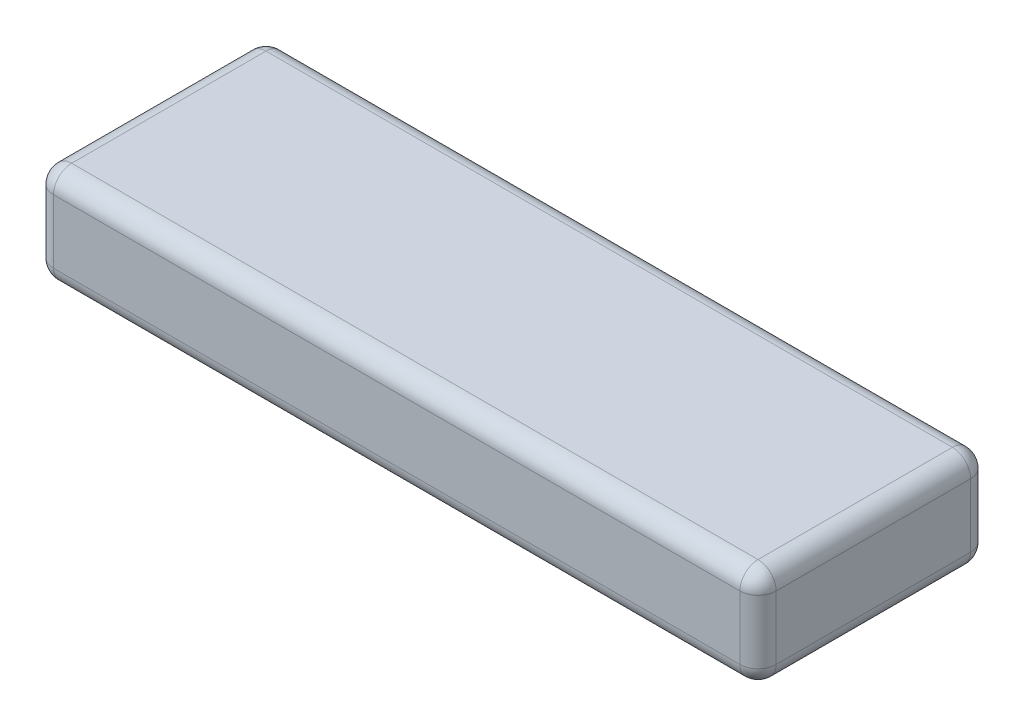
ISO-10303-21;
HEADER;
FILE_DESCRIPTION(('STEP AP214'),'2;1');
FILE_NAME('part.step','',(''),(''),'','','');
FILE_SCHEMA(('AUTOMOTIVE_DESIGN { 1 0 10303 214 1 1 1 1 }'));
ENDSEC;
DATA;
#1=APPLICATION_CONTEXT('core data for automotive mechanical design processes');
#2=APPLICATION_PROTOCOL_DEFINITION('international standard','automotive_design',2000,#1);
#3=PRODUCT_CONTEXT('',#1,'mechanical');
#4=PRODUCT('Part','Part','',(#3));
#5=PRODUCT_RELATED_PRODUCT_CATEGORY('part','',(#4));
#6=PRODUCT_DEFINITION_FORMATION('','',#4);
#7=PRODUCT_DEFINITION_CONTEXT('part definition',#1,'design');
#8=PRODUCT_DEFINITION('design','',#6,#7);
#9=PRODUCT_DEFINITION_SHAPE('','',#8);
#10=(LENGTH_UNIT() NAMED_UNIT(*) SI_UNIT(.MILLI.,.METRE.));
#11=(NAMED_UNIT(*) PLANE_ANGLE_UNIT() SI_UNIT($,.RADIAN.));
#12=(NAMED_UNIT(*) SI_UNIT($,.STERADIAN.) SOLID_ANGLE_UNIT());
#13=UNCERTAINTY_MEASURE_WITH_UNIT(LENGTH_MEASURE(1.E-05),#10,'distance_accuracy_value','');
#14=(GEOMETRIC_REPRESENTATION_CONTEXT(3) GLOBAL_UNCERTAINTY_ASSIGNED_CONTEXT((#13)) GLOBAL_UNIT_ASSIGNED_CONTEXT((#10,
#11,#12)) REPRESENTATION_CONTEXT('',''));
#15=CARTESIAN_POINT('',(0.,0.,0.));
#16=DIRECTION('',(0.,0.,1.));
#17=DIRECTION('',(1.,0.,0.));
#18=AXIS2_PLACEMENT_3D('',#15,#16,#17);
#19=CARTESIAN_POINT('',(29.845,8.255,9.525));
#20=DIRECTION('',(-1.,0.,0.));
#21=DIRECTION('',(0.,0.,1.));
#22=AXIS2_PLACEMENT_3D('',#19,#20,#21);
#23=PLANE('',#22);
#24=DIRECTION('',(0.,-1.,0.));
#25=VECTOR('',#24,1.);
#26=CARTESIAN_POINT('',(29.845,8.255,8.025));
#27=LINE('',#26,#25);
#28=CARTESIAN_POINT('',(29.845,6.755,8.025));
#29=VERTEX_POINT('',#28);
#30=CARTESIAN_POINT('',(29.845,1.5,8.025));
#31=VERTEX_POINT('',#30);
#32=EDGE_CURVE('E227',#29,#31,#27,.T.);
#33=ORIENTED_EDGE('',*,*,#32,.T.);
#34=DIRECTION('',(0.,0.,-1.));
#35=VECTOR('',#34,1.);
#36=CARTESIAN_POINT('',(29.845,1.5,-9.525));
#37=LINE('',#36,#35);
#38=CARTESIAN_POINT('',(29.845,1.5,-8.025));
#39=VERTEX_POINT('',#38);
#40=EDGE_CURVE('E231',#31,#39,#37,.T.);
#41=ORIENTED_EDGE('',*,*,#40,.T.);
#42=DIRECTION('',(0.,-1.,0.));
#43=VECTOR('',#42,1.);
#44=CARTESIAN_POINT('',(29.845,8.255,-8.025));
#45=LINE('',#44,#43);
#46=CARTESIAN_POINT('',(29.845,6.755,-8.025));
#47=VERTEX_POINT('',#46);
#48=EDGE_CURVE('E224',#39,#47,#45,.F.);
#49=ORIENTED_EDGE('',*,*,#48,.T.);
#50=DIRECTION('',(0.,0.,-1.));
#51=VECTOR('',#50,1.);
#52=CARTESIAN_POINT('',(29.845,6.755,9.525));
#53=LINE('',#52,#51);
#54=EDGE_CURVE('E221',#47,#29,#53,.F.);
#55=ORIENTED_EDGE('',*,*,#54,.T.);
#56=EDGE_LOOP('',(#33,#41,#49,#55));
#57=FACE_BOUND('',#56,.T.);
#58=ADVANCED_FACE('F45',(#57),#23,.F.);
#59=CARTESIAN_POINT('',(-29.845,8.255,-9.525));
#60=DIRECTION('',(0.,0.,1.));
#61=DIRECTION('',(1.,0.,0.));
#62=AXIS2_PLACEMENT_3D('',#59,#60,#61);
#63=PLANE('',#62);
#64=DIRECTION('',(-1.,0.,0.));
#65=VECTOR('',#64,1.);
#66=CARTESIAN_POINT('',(-29.845,1.5,-9.525));
#67=LINE('',#66,#65);
#68=CARTESIAN_POINT('',(28.345,1.5,-9.525));
#69=VERTEX_POINT('',#68);
#70=CARTESIAN_POINT('',(-28.345,1.5,-9.525));
#71=VERTEX_POINT('',#70);
#72=EDGE_CURVE('E190',#69,#71,#67,.T.);
#73=ORIENTED_EDGE('',*,*,#72,.T.);
#74=DIRECTION('',(0.,-1.,0.));
#75=VECTOR('',#74,1.);
#76=CARTESIAN_POINT('',(-28.345,8.255,-9.525));
#77=LINE('',#76,#75);
#78=CARTESIAN_POINT('',(-28.345,6.755,-9.525));
#79=VERTEX_POINT('',#78);
#80=EDGE_CURVE('E193',#71,#79,#77,.F.);
#81=ORIENTED_EDGE('',*,*,#80,.T.);
#82=DIRECTION('',(-1.,0.,0.));
#83=VECTOR('',#82,1.);
#84=CARTESIAN_POINT('',(-29.845,6.755,-9.525));
#85=LINE('',#84,#83);
#86=CARTESIAN_POINT('',(28.345,6.755,-9.525));
#87=VERTEX_POINT('',#86);
#88=EDGE_CURVE('E184',#79,#87,#85,.F.);
#89=ORIENTED_EDGE('',*,*,#88,.T.);
#90=DIRECTION('',(0.,-1.,0.));
#91=VECTOR('',#90,1.);
#92=CARTESIAN_POINT('',(28.345,8.255,-9.525));
#93=LINE('',#92,#91);
#94=EDGE_CURVE('E187',#87,#69,#93,.T.);
#95=ORIENTED_EDGE('',*,*,#94,.T.);
#96=EDGE_LOOP('',(#73,#81,#89,#95));
#97=FACE_BOUND('',#96,.T.);
#98=ADVANCED_FACE('F365',(#97),#63,.F.);
#99=CARTESIAN_POINT('',(-29.845,8.255,9.525));
#100=DIRECTION('',(1.,0.,0.));
#101=DIRECTION('',(0.,0.,-1.));
#102=AXIS2_PLACEMENT_3D('',#99,#100,#101);
#103=PLANE('',#102);
#104=DIRECTION('',(0.,-1.,0.));
#105=VECTOR('',#104,1.);
#106=CARTESIAN_POINT('',(-29.845,8.255,-8.025));
#107=LINE('',#106,#105);
#108=CARTESIAN_POINT('',(-29.845,6.755,-8.025));
#109=VERTEX_POINT('',#108);
#110=CARTESIAN_POINT('',(-29.845,1.5,-8.025));
#111=VERTEX_POINT('',#110);
#112=EDGE_CURVE('E146',#109,#111,#107,.T.);
#113=ORIENTED_EDGE('',*,*,#112,.T.);
#114=DIRECTION('',(0.,0.,1.));
#115=VECTOR('',#114,1.);
#116=CARTESIAN_POINT('',(-29.845,1.5,9.525));
#117=LINE('',#116,#115);
#118=CARTESIAN_POINT('',(-29.845,1.5,8.025));
#119=VERTEX_POINT('',#118);
#120=EDGE_CURVE('E141',#111,#119,#117,.T.);
#121=ORIENTED_EDGE('',*,*,#120,.T.);
#122=DIRECTION('',(0.,-1.,0.));
#123=VECTOR('',#122,1.);
#124=CARTESIAN_POINT('',(-29.845,8.255,8.025));
#125=LINE('',#124,#123);
#126=CARTESIAN_POINT('',(-29.845,6.755,8.025));
#127=VERTEX_POINT('',#126);
#128=EDGE_CURVE('E133',#119,#127,#125,.F.);
#129=ORIENTED_EDGE('',*,*,#128,.T.);
#130=DIRECTION('',(0.,0.,1.));
#131=VECTOR('',#130,1.);
#132=CARTESIAN_POINT('',(-29.845,6.755,9.525));
#133=LINE('',#132,#131);
#134=EDGE_CURVE('E138',#127,#109,#133,.F.);
#135=ORIENTED_EDGE('',*,*,#134,.T.);
#136=EDGE_LOOP('',(#113,#121,#129,#135));
#137=FACE_BOUND('',#136,.T.);
#138=ADVANCED_FACE('F136',(#137),#103,.F.);
#139=CARTESIAN_POINT('',(-29.845,8.255,9.525));
#140=DIRECTION('',(0.,0.,-1.));
#141=DIRECTION('',(-1.,0.,0.));
#142=AXIS2_PLACEMENT_3D('',#139,#140,#141);
#143=PLANE('',#142);
#144=DIRECTION('',(1.,0.,0.));
#145=VECTOR('',#144,1.);
#146=CARTESIAN_POINT('',(-29.845,6.755,9.525));
#147=LINE('',#146,#145);
#148=CARTESIAN_POINT('',(28.345,6.755,9.525));
#149=VERTEX_POINT('',#148);
#150=CARTESIAN_POINT('',(-28.345,6.755,9.525));
#151=VERTEX_POINT('',#150);
#152=EDGE_CURVE('E197',#149,#151,#147,.F.);
#153=ORIENTED_EDGE('',*,*,#152,.T.);
#154=DIRECTION('',(0.,-1.,0.));
#155=VECTOR('',#154,1.);
#156=CARTESIAN_POINT('',(-28.345,8.255,9.525));
#157=LINE('',#156,#155);
#158=CARTESIAN_POINT('',(-28.345,1.5,9.525));
#159=VERTEX_POINT('',#158);
#160=EDGE_CURVE('E154',#151,#159,#157,.T.);
#161=ORIENTED_EDGE('',*,*,#160,.T.);
#162=DIRECTION('',(1.,0.,0.));
#163=VECTOR('',#162,1.);
#164=CARTESIAN_POINT('',(29.845,1.5,9.525));
#165=LINE('',#164,#163);
#166=CARTESIAN_POINT('',(28.345,1.5,9.525));
#167=VERTEX_POINT('',#166);
#168=EDGE_CURVE('E203',#159,#167,#165,.T.);
#169=ORIENTED_EDGE('',*,*,#168,.T.);
#170=DIRECTION('',(0.,-1.,0.));
#171=VECTOR('',#170,1.);
#172=CARTESIAN_POINT('',(28.345,8.255,9.525));
#173=LINE('',#172,#171);
#174=EDGE_CURVE('E200',#167,#149,#173,.F.);
#175=ORIENTED_EDGE('',*,*,#174,.T.);
#176=EDGE_LOOP('',(#153,#161,#169,#175));
#177=FACE_BOUND('',#176,.T.);
#178=ADVANCED_FACE('F356',(#177),#143,.F.);
#179=CARTESIAN_POINT('',(0.,8.255,0.));
#180=DIRECTION('',(0.,-1.,0.));
#181=DIRECTION('',(0.,0.,-1.));
#182=AXIS2_PLACEMENT_3D('',#179,#180,#181);
#183=PLANE('',#182);
#184=DIRECTION('',(0.,0.,1.));
#185=VECTOR('',#184,1.);
#186=CARTESIAN_POINT('',(-28.345,8.255,0.));
#187=LINE('',#186,#185);
#188=CARTESIAN_POINT('',(-28.345,8.255,-8.025));
#189=VERTEX_POINT('',#188);
#190=CARTESIAN_POINT('',(-28.345,8.255,8.025));
#191=VERTEX_POINT('',#190);
#192=EDGE_CURVE('E55',#189,#191,#187,.T.);
#193=ORIENTED_EDGE('',*,*,#192,.T.);
#194=DIRECTION('',(1.,0.,0.));
#195=VECTOR('',#194,1.);
#196=CARTESIAN_POINT('',(0.,8.255,8.025));
#197=LINE('',#196,#195);
#198=CARTESIAN_POINT('',(28.345,8.255,8.025));
#199=VERTEX_POINT('',#198);
#200=EDGE_CURVE('E11',#191,#199,#197,.T.);
#201=ORIENTED_EDGE('',*,*,#200,.T.);
#202=DIRECTION('',(0.,0.,-1.));
#203=VECTOR('',#202,1.);
#204=CARTESIAN_POINT('',(28.345,8.255,0.));
#205=LINE('',#204,#203);
#206=CARTESIAN_POINT('',(28.345,8.255,-8.025));
#207=VERTEX_POINT('',#206);
#208=EDGE_CURVE('E234',#199,#207,#205,.T.);
#209=ORIENTED_EDGE('',*,*,#208,.T.);
#210=DIRECTION('',(-1.,0.,0.));
#211=VECTOR('',#210,1.);
#212=CARTESIAN_POINT('',(0.,8.255,-8.025));
#213=LINE('',#212,#211);
#214=EDGE_CURVE('E66',#207,#189,#213,.T.);
#215=ORIENTED_EDGE('',*,*,#214,.T.);
#216=EDGE_LOOP('',(#193,#201,#209,#215));
#217=FACE_BOUND('',#216,.T.);
#218=ADVANCED_FACE('F358',(#217),#183,.F.);
#219=CARTESIAN_POINT('',(0.,0.,0.));
#220=DIRECTION('',(0.,-1.,0.));
#221=DIRECTION('',(0.,0.,-1.));
#222=AXIS2_PLACEMENT_3D('',#219,#220,#221);
#223=PLANE('',#222);
#224=DIRECTION('',(0.,0.,1.));
#225=VECTOR('',#224,1.);
#226=CARTESIAN_POINT('',(-28.345,0.,-9.525));
#227=LINE('',#226,#225);
#228=CARTESIAN_POINT('',(-28.345,0.,8.025));
#229=VERTEX_POINT('',#228);
#230=CARTESIAN_POINT('',(-28.345,0.,-8.025));
#231=VERTEX_POINT('',#230);
#232=EDGE_CURVE('E214',#229,#231,#227,.F.);
#233=ORIENTED_EDGE('',*,*,#232,.T.);
#234=DIRECTION('',(-1.,0.,0.));
#235=VECTOR('',#234,1.);
#236=CARTESIAN_POINT('',(29.845,0.,-8.025));
#237=LINE('',#236,#235);
#238=CARTESIAN_POINT('',(28.345,0.,-8.025));
#239=VERTEX_POINT('',#238);
#240=EDGE_CURVE('E217',#231,#239,#237,.F.);
#241=ORIENTED_EDGE('',*,*,#240,.T.);
#242=DIRECTION('',(0.,0.,-1.));
#243=VECTOR('',#242,1.);
#244=CARTESIAN_POINT('',(28.345,0.,9.525));
#245=LINE('',#244,#243);
#246=CARTESIAN_POINT('',(28.345,0.,8.025));
#247=VERTEX_POINT('',#246);
#248=EDGE_CURVE('E208',#239,#247,#245,.F.);
#249=ORIENTED_EDGE('',*,*,#248,.T.);
#250=DIRECTION('',(1.,0.,0.));
#251=VECTOR('',#250,1.);
#252=CARTESIAN_POINT('',(-29.845,0.,8.025));
#253=LINE('',#252,#251);
#254=EDGE_CURVE('E211',#247,#229,#253,.F.);
#255=ORIENTED_EDGE('',*,*,#254,.T.);
#256=EDGE_LOOP('',(#233,#241,#249,#255));
#257=FACE_BOUND('',#256,.T.);
#258=ADVANCED_FACE('F325',(#257),#223,.T.);
#259=CARTESIAN_POINT('',(28.345,8.255,8.025));
#260=DIRECTION('',(0.,-1.,0.));
#261=DIRECTION('',(0.,0.,-1.));
#262=AXIS2_PLACEMENT_3D('',#259,#260,#261);
#263=CYLINDRICAL_SURFACE('',#262,1.5);
#264=CARTESIAN_POINT('',(28.345,6.755,8.025));
#265=DIRECTION('',(0.,1.,0.));
#266=DIRECTION('',(0.,0.,1.));
#267=AXIS2_PLACEMENT_3D('',#264,#265,#266);
#268=CIRCLE('',#267,1.5);
#269=EDGE_CURVE('E49',#149,#29,#268,.T.);
#270=ORIENTED_EDGE('',*,*,#269,.F.);
#271=ORIENTED_EDGE('',*,*,#174,.F.);
#272=CARTESIAN_POINT('',(28.345,1.5,8.025));
#273=DIRECTION('',(0.,-1.,0.));
#274=DIRECTION('',(0.,0.,-1.));
#275=AXIS2_PLACEMENT_3D('',#272,#273,#274);
#276=CIRCLE('',#275,1.5);
#277=EDGE_CURVE('E178',#31,#167,#276,.T.);
#278=ORIENTED_EDGE('',*,*,#277,.F.);
#279=ORIENTED_EDGE('',*,*,#32,.F.);
#280=EDGE_LOOP('',(#270,#271,#278,#279));
#281=FACE_BOUND('',#280,.T.);
#282=ADVANCED_FACE('F47',(#281),#263,.T.);
#283=CARTESIAN_POINT('',(28.345,6.755,8.025));
#284=DIRECTION('',(1.,0.,0.));
#285=DIRECTION('',(0.,0.,-1.));
#286=AXIS2_PLACEMENT_3D('',#283,#284,#285);
#287=SPHERICAL_SURFACE('',#286,1.5);
#288=CARTESIAN_POINT('',(28.345,6.755,8.025));
#289=DIRECTION('',(1.,0.,0.));
#290=DIRECTION('',(0.,0.,-1.));
#291=AXIS2_PLACEMENT_3D('',#288,#289,#290);
#292=CIRCLE('',#291,1.5);
#293=EDGE_CURVE('E301',#149,#199,#292,.F.);
#294=ORIENTED_EDGE('',*,*,#293,.F.);
#295=ORIENTED_EDGE('',*,*,#269,.T.);
#296=CARTESIAN_POINT('',(28.345,6.755,8.025));
#297=DIRECTION('',(0.,0.,1.));
#298=DIRECTION('',(1.,0.,0.));
#299=AXIS2_PLACEMENT_3D('',#296,#297,#298);
#300=CIRCLE('',#299,1.5);
#301=EDGE_CURVE('E305',#199,#29,#300,.F.);
#302=ORIENTED_EDGE('',*,*,#301,.F.);
#303=EDGE_LOOP('',(#294,#295,#302));
#304=FACE_BOUND('',#303,.T.);
#305=ADVANCED_FACE('F351',(#304),#287,.T.);
#306=CARTESIAN_POINT('',(28.345,1.5,8.025));
#307=DIRECTION('',(0.,0.,1.));
#308=DIRECTION('',(0.,-1.,0.));
#309=AXIS2_PLACEMENT_3D('',#306,#307,#308);
#310=SPHERICAL_SURFACE('',#309,1.5);
#311=CARTESIAN_POINT('',(28.345,1.5,8.025));
#312=DIRECTION('',(0.,0.,1.));
#313=DIRECTION('',(1.,0.,0.));
#314=AXIS2_PLACEMENT_3D('',#311,#312,#313);
#315=CIRCLE('',#314,1.5);
#316=EDGE_CURVE('E293',#31,#247,#315,.F.);
#317=ORIENTED_EDGE('',*,*,#316,.F.);
#318=ORIENTED_EDGE('',*,*,#277,.T.);
#319=CARTESIAN_POINT('',(28.345,1.5,8.025));
#320=DIRECTION('',(1.,0.,0.));
#321=DIRECTION('',(0.,0.,-1.));
#322=AXIS2_PLACEMENT_3D('',#319,#320,#321);
#323=CIRCLE('',#322,1.5);
#324=EDGE_CURVE('E297',#247,#167,#323,.F.);
#325=ORIENTED_EDGE('',*,*,#324,.F.);
#326=EDGE_LOOP('',(#317,#318,#325));
#327=FACE_BOUND('',#326,.T.);
#328=ADVANCED_FACE('F314',(#327),#310,.T.);
#329=CARTESIAN_POINT('',(28.345,6.755,0.));
#330=DIRECTION('',(0.,0.,-1.));
#331=DIRECTION('',(-1.,0.,0.));
#332=AXIS2_PLACEMENT_3D('',#329,#330,#331);
#333=CYLINDRICAL_SURFACE('',#332,1.5);
#334=ORIENTED_EDGE('',*,*,#301,.T.);
#335=ORIENTED_EDGE('',*,*,#54,.F.);
#336=CARTESIAN_POINT('',(28.345,6.755,-8.025));
#337=DIRECTION('',(0.,0.,-1.));
#338=DIRECTION('',(-1.,0.,0.));
#339=AXIS2_PLACEMENT_3D('',#336,#337,#338);
#340=CIRCLE('',#339,1.5);
#341=EDGE_CURVE('E285',#207,#47,#340,.T.);
#342=ORIENTED_EDGE('',*,*,#341,.F.);
#343=ORIENTED_EDGE('',*,*,#208,.F.);
#344=EDGE_LOOP('',(#334,#335,#342,#343));
#345=FACE_BOUND('',#344,.T.);
#346=ADVANCED_FACE('F346',(#345),#333,.T.);
#347=CARTESIAN_POINT('',(0.,6.755,8.025));
#348=DIRECTION('',(1.,0.,0.));
#349=DIRECTION('',(0.,0.,-1.));
#350=AXIS2_PLACEMENT_3D('',#347,#348,#349);
#351=CYLINDRICAL_SURFACE('',#350,1.5);
#352=ORIENTED_EDGE('',*,*,#293,.T.);
#353=ORIENTED_EDGE('',*,*,#200,.F.);
#354=CARTESIAN_POINT('',(-28.345,6.755,8.025));
#355=DIRECTION('',(-1.,0.,0.));
#356=DIRECTION('',(0.,0.,1.));
#357=AXIS2_PLACEMENT_3D('',#354,#355,#356);
#358=CIRCLE('',#357,1.5);
#359=EDGE_CURVE('E159',#151,#191,#358,.T.);
#360=ORIENTED_EDGE('',*,*,#359,.F.);
#361=ORIENTED_EDGE('',*,*,#152,.F.);
#362=EDGE_LOOP('',(#352,#353,#360,#361));
#363=FACE_BOUND('',#362,.T.);
#364=ADVANCED_FACE('F354',(#363),#351,.T.);
#365=CARTESIAN_POINT('',(-28.345,8.255,8.025));
#366=DIRECTION('',(0.,-1.,0.));
#367=DIRECTION('',(0.,0.,-1.));
#368=AXIS2_PLACEMENT_3D('',#365,#366,#367);
#369=CYLINDRICAL_SURFACE('',#368,1.5);
#370=CARTESIAN_POINT('',(-28.345,1.5,8.025));
#371=DIRECTION('',(0.,-1.,0.));
#372=DIRECTION('',(0.,0.,-1.));
#373=AXIS2_PLACEMENT_3D('',#370,#371,#372);
#374=CIRCLE('',#373,1.5);
#375=EDGE_CURVE('E160',#159,#119,#374,.T.);
#376=ORIENTED_EDGE('',*,*,#375,.F.);
#377=ORIENTED_EDGE('',*,*,#160,.F.);
#378=CARTESIAN_POINT('',(-28.345,6.755,8.025));
#379=DIRECTION('',(0.,1.,0.));
#380=DIRECTION('',(0.,0.,1.));
#381=AXIS2_PLACEMENT_3D('',#378,#379,#380);
#382=CIRCLE('',#381,1.5);
#383=EDGE_CURVE('E150',#127,#151,#382,.T.);
#384=ORIENTED_EDGE('',*,*,#383,.F.);
#385=ORIENTED_EDGE('',*,*,#128,.F.);
#386=EDGE_LOOP('',(#376,#377,#384,#385));
#387=FACE_BOUND('',#386,.T.);
#388=ADVANCED_FACE('F152',(#387),#369,.T.);
#389=CARTESIAN_POINT('',(-29.845,1.5,8.025));
#390=DIRECTION('',(-1.,0.,0.));
#391=DIRECTION('',(0.,0.,1.));
#392=AXIS2_PLACEMENT_3D('',#389,#390,#391);
#393=CYLINDRICAL_SURFACE('',#392,1.5);
#394=ORIENTED_EDGE('',*,*,#324,.T.);
#395=ORIENTED_EDGE('',*,*,#168,.F.);
#396=CARTESIAN_POINT('',(-28.345,1.5,8.025));
#397=DIRECTION('',(-1.,0.,0.));
#398=DIRECTION('',(0.,0.,1.));
#399=AXIS2_PLACEMENT_3D('',#396,#397,#398);
#400=CIRCLE('',#399,1.5);
#401=EDGE_CURVE('E278',#229,#159,#400,.T.);
#402=ORIENTED_EDGE('',*,*,#401,.F.);
#403=ORIENTED_EDGE('',*,*,#254,.F.);
#404=EDGE_LOOP('',(#394,#395,#402,#403));
#405=FACE_BOUND('',#404,.T.);
#406=ADVANCED_FACE('F321',(#405),#393,.T.);
#407=CARTESIAN_POINT('',(28.345,1.5,9.525));
#408=DIRECTION('',(0.,0.,1.));
#409=DIRECTION('',(1.,0.,0.));
#410=AXIS2_PLACEMENT_3D('',#407,#408,#409);
#411=CYLINDRICAL_SURFACE('',#410,1.5);
#412=ORIENTED_EDGE('',*,*,#316,.T.);
#413=ORIENTED_EDGE('',*,*,#248,.F.);
#414=CARTESIAN_POINT('',(28.345,1.5,-8.025));
#415=DIRECTION('',(0.,0.,-1.));
#416=DIRECTION('',(-1.,0.,0.));
#417=AXIS2_PLACEMENT_3D('',#414,#415,#416);
#418=CIRCLE('',#417,1.5);
#419=EDGE_CURVE('E274',#39,#239,#418,.T.);
#420=ORIENTED_EDGE('',*,*,#419,.F.);
#421=ORIENTED_EDGE('',*,*,#40,.F.);
#422=EDGE_LOOP('',(#412,#413,#420,#421));
#423=FACE_BOUND('',#422,.T.);
#424=ADVANCED_FACE('F331',(#423),#411,.T.);
#425=CARTESIAN_POINT('',(28.345,8.255,-8.025));
#426=DIRECTION('',(0.,-1.,0.));
#427=DIRECTION('',(0.,0.,-1.));
#428=AXIS2_PLACEMENT_3D('',#425,#426,#427);
#429=CYLINDRICAL_SURFACE('',#428,1.5);
#430=CARTESIAN_POINT('',(28.345,6.755,-8.025));
#431=DIRECTION('',(0.,1.,0.));
#432=DIRECTION('',(0.,0.,1.));
#433=AXIS2_PLACEMENT_3D('',#430,#431,#432);
#434=CIRCLE('',#433,1.5);
#435=EDGE_CURVE('E289',#47,#87,#434,.T.);
#436=ORIENTED_EDGE('',*,*,#435,.F.);
#437=ORIENTED_EDGE('',*,*,#48,.F.);
#438=CARTESIAN_POINT('',(28.345,1.5,-8.025));
#439=DIRECTION('',(0.,-1.,0.));
#440=DIRECTION('',(0.,0.,-1.));
#441=AXIS2_PLACEMENT_3D('',#438,#439,#440);
#442=CIRCLE('',#441,1.5);
#443=EDGE_CURVE('E270',#69,#39,#442,.T.);
#444=ORIENTED_EDGE('',*,*,#443,.F.);
#445=ORIENTED_EDGE('',*,*,#94,.F.);
#446=EDGE_LOOP('',(#436,#437,#444,#445));
#447=FACE_BOUND('',#446,.T.);
#448=ADVANCED_FACE('F338',(#447),#429,.T.);
#449=CARTESIAN_POINT('',(28.345,6.755,-8.025));
#450=DIRECTION('',(1.,0.,0.));
#451=DIRECTION('',(0.,0.,-1.));
#452=AXIS2_PLACEMENT_3D('',#449,#450,#451);
#453=SPHERICAL_SURFACE('',#452,1.5);
#454=ORIENTED_EDGE('',*,*,#341,.T.);
#455=ORIENTED_EDGE('',*,*,#435,.T.);
#456=CARTESIAN_POINT('',(28.345,6.755,-8.025));
#457=DIRECTION('',(1.,0.,0.));
#458=DIRECTION('',(0.,0.,-1.));
#459=AXIS2_PLACEMENT_3D('',#456,#457,#458);
#460=CIRCLE('',#459,1.5);
#461=EDGE_CURVE('E167',#207,#87,#460,.F.);
#462=ORIENTED_EDGE('',*,*,#461,.F.);
#463=EDGE_LOOP('',(#454,#455,#462));
#464=FACE_BOUND('',#463,.T.);
#465=ADVANCED_FACE('F344',(#464),#453,.T.);
#466=CARTESIAN_POINT('',(-28.345,6.755,8.025));
#467=DIRECTION('',(0.,0.,1.));
#468=DIRECTION('',(1.,0.,0.));
#469=AXIS2_PLACEMENT_3D('',#466,#467,#468);
#470=SPHERICAL_SURFACE('',#469,1.5);
#471=ORIENTED_EDGE('',*,*,#383,.T.);
#472=ORIENTED_EDGE('',*,*,#359,.T.);
#473=CARTESIAN_POINT('',(-28.345,6.755,8.025));
#474=DIRECTION('',(0.,0.,1.));
#475=DIRECTION('',(1.,0.,0.));
#476=AXIS2_PLACEMENT_3D('',#473,#474,#475);
#477=CIRCLE('',#476,1.5);
#478=EDGE_CURVE('E163',#127,#191,#477,.F.);
#479=ORIENTED_EDGE('',*,*,#478,.F.);
#480=EDGE_LOOP('',(#471,#472,#479));
#481=FACE_BOUND('',#480,.T.);
#482=ADVANCED_FACE('F164',(#481),#470,.T.);
#483=CARTESIAN_POINT('',(-28.345,1.5,8.025));
#484=DIRECTION('',(0.,0.,1.));
#485=DIRECTION('',(0.,-1.,0.));
#486=AXIS2_PLACEMENT_3D('',#483,#484,#485);
#487=SPHERICAL_SURFACE('',#486,1.5);
#488=ORIENTED_EDGE('',*,*,#401,.T.);
#489=ORIENTED_EDGE('',*,*,#375,.T.);
#490=CARTESIAN_POINT('',(-28.345,1.5,8.025));
#491=DIRECTION('',(0.,0.,1.));
#492=DIRECTION('',(1.,0.,0.));
#493=AXIS2_PLACEMENT_3D('',#490,#491,#492);
#494=CIRCLE('',#493,1.5);
#495=EDGE_CURVE('E168',#229,#119,#494,.F.);
#496=ORIENTED_EDGE('',*,*,#495,.F.);
#497=EDGE_LOOP('',(#488,#489,#496));
#498=FACE_BOUND('',#497,.T.);
#499=ADVANCED_FACE('F405',(#498),#487,.T.);
#500=CARTESIAN_POINT('',(28.345,1.5,-8.025));
#501=DIRECTION('',(1.,0.,0.));
#502=DIRECTION('',(0.,1.,0.));
#503=AXIS2_PLACEMENT_3D('',#500,#501,#502);
#504=SPHERICAL_SURFACE('',#503,1.5);
#505=ORIENTED_EDGE('',*,*,#443,.T.);
#506=ORIENTED_EDGE('',*,*,#419,.T.);
#507=CARTESIAN_POINT('',(28.345,1.5,-8.025));
#508=DIRECTION('',(1.,0.,0.));
#509=DIRECTION('',(0.,0.,-1.));
#510=AXIS2_PLACEMENT_3D('',#507,#508,#509);
#511=CIRCLE('',#510,1.5);
#512=EDGE_CURVE('E261',#69,#239,#511,.F.);
#513=ORIENTED_EDGE('',*,*,#512,.F.);
#514=EDGE_LOOP('',(#505,#506,#513));
#515=FACE_BOUND('',#514,.T.);
#516=ADVANCED_FACE('F401',(#515),#504,.T.);
#517=CARTESIAN_POINT('',(0.,6.755,-8.025));
#518=DIRECTION('',(-1.,0.,0.));
#519=DIRECTION('',(0.,0.,1.));
#520=AXIS2_PLACEMENT_3D('',#517,#518,#519);
#521=CYLINDRICAL_SURFACE('',#520,1.5);
#522=ORIENTED_EDGE('',*,*,#461,.T.);
#523=ORIENTED_EDGE('',*,*,#88,.F.);
#524=CARTESIAN_POINT('',(-28.345,6.755,-8.025));
#525=DIRECTION('',(-1.,0.,0.));
#526=DIRECTION('',(0.,0.,1.));
#527=AXIS2_PLACEMENT_3D('',#524,#525,#526);
#528=CIRCLE('',#527,1.5);
#529=EDGE_CURVE('E257',#189,#79,#528,.T.);
#530=ORIENTED_EDGE('',*,*,#529,.F.);
#531=ORIENTED_EDGE('',*,*,#214,.F.);
#532=EDGE_LOOP('',(#522,#523,#530,#531));
#533=FACE_BOUND('',#532,.T.);
#534=ADVANCED_FACE('F398',(#533),#521,.T.);
#535=CARTESIAN_POINT('',(-28.345,6.755,0.));
#536=DIRECTION('',(0.,0.,1.));
#537=DIRECTION('',(1.,0.,0.));
#538=AXIS2_PLACEMENT_3D('',#535,#536,#537);
#539=CYLINDRICAL_SURFACE('',#538,1.5);
#540=ORIENTED_EDGE('',*,*,#478,.T.);
#541=ORIENTED_EDGE('',*,*,#192,.F.);
#542=CARTESIAN_POINT('',(-28.345,6.755,-8.025));
#543=DIRECTION('',(0.,0.,-1.));
#544=DIRECTION('',(0.,1.,0.));
#545=AXIS2_PLACEMENT_3D('',#542,#543,#544);
#546=CIRCLE('',#545,1.5);
#547=EDGE_CURVE('E172',#109,#189,#546,.T.);
#548=ORIENTED_EDGE('',*,*,#547,.F.);
#549=ORIENTED_EDGE('',*,*,#134,.F.);
#550=EDGE_LOOP('',(#540,#541,#548,#549));
#551=FACE_BOUND('',#550,.T.);
#552=ADVANCED_FACE('F170',(#551),#539,.T.);
#553=CARTESIAN_POINT('',(-28.345,1.5,9.525));
#554=DIRECTION('',(0.,0.,-1.));
#555=DIRECTION('',(-1.,0.,0.));
#556=AXIS2_PLACEMENT_3D('',#553,#554,#555);
#557=CYLINDRICAL_SURFACE('',#556,1.5);
#558=ORIENTED_EDGE('',*,*,#495,.T.);
#559=ORIENTED_EDGE('',*,*,#120,.F.);
#560=CARTESIAN_POINT('',(-28.345,1.5,-8.025));
#561=DIRECTION('',(0.,0.,-1.));
#562=DIRECTION('',(-1.,0.,0.));
#563=AXIS2_PLACEMENT_3D('',#560,#561,#562);
#564=CIRCLE('',#563,1.5);
#565=EDGE_CURVE('E251',#231,#111,#564,.T.);
#566=ORIENTED_EDGE('',*,*,#565,.F.);
#567=ORIENTED_EDGE('',*,*,#232,.F.);
#568=EDGE_LOOP('',(#558,#559,#566,#567));
#569=FACE_BOUND('',#568,.T.);
#570=ADVANCED_FACE('F391',(#569),#557,.T.);
#571=CARTESIAN_POINT('',(-29.845,1.5,-8.025));
#572=DIRECTION('',(1.,0.,0.));
#573=DIRECTION('',(0.,0.,-1.));
#574=AXIS2_PLACEMENT_3D('',#571,#572,#573);
#575=CYLINDRICAL_SURFACE('',#574,1.5);
#576=ORIENTED_EDGE('',*,*,#512,.T.);
#577=ORIENTED_EDGE('',*,*,#240,.F.);
#578=CARTESIAN_POINT('',(-28.345,1.5,-8.025));
#579=DIRECTION('',(-1.,0.,0.));
#580=DIRECTION('',(0.,0.,1.));
#581=AXIS2_PLACEMENT_3D('',#578,#579,#580);
#582=CIRCLE('',#581,1.5);
#583=EDGE_CURVE('E247',#71,#231,#582,.T.);
#584=ORIENTED_EDGE('',*,*,#583,.F.);
#585=ORIENTED_EDGE('',*,*,#72,.F.);
#586=EDGE_LOOP('',(#576,#577,#584,#585));
#587=FACE_BOUND('',#586,.T.);
#588=ADVANCED_FACE('F387',(#587),#575,.T.);
#589=CARTESIAN_POINT('',(-28.345,6.755,-8.025));
#590=DIRECTION('',(0.,1.,0.));
#591=DIRECTION('',(0.,0.,1.));
#592=AXIS2_PLACEMENT_3D('',#589,#590,#591);
#593=SPHERICAL_SURFACE('',#592,1.5);
#594=ORIENTED_EDGE('',*,*,#547,.T.);
#595=ORIENTED_EDGE('',*,*,#529,.T.);
#596=CARTESIAN_POINT('',(-28.345,6.755,-8.025));
#597=DIRECTION('',(0.,1.,0.));
#598=DIRECTION('',(0.,0.,1.));
#599=AXIS2_PLACEMENT_3D('',#596,#597,#598);
#600=CIRCLE('',#599,1.5);
#601=EDGE_CURVE('E244',#109,#79,#600,.F.);
#602=ORIENTED_EDGE('',*,*,#601,.F.);
#603=EDGE_LOOP('',(#594,#595,#602));
#604=FACE_BOUND('',#603,.T.);
#605=ADVANCED_FACE('F383',(#604),#593,.T.);
#606=CARTESIAN_POINT('',(-28.345,1.5,-8.025));
#607=DIRECTION('',(0.,-1.,0.));
#608=DIRECTION('',(0.,0.,-1.));
#609=AXIS2_PLACEMENT_3D('',#606,#607,#608);
#610=SPHERICAL_SURFACE('',#609,1.5);
#611=ORIENTED_EDGE('',*,*,#583,.T.);
#612=ORIENTED_EDGE('',*,*,#565,.T.);
#613=CARTESIAN_POINT('',(-28.345,1.5,-8.025));
#614=DIRECTION('',(0.,-1.,0.));
#615=DIRECTION('',(0.,0.,-1.));
#616=AXIS2_PLACEMENT_3D('',#613,#614,#615);
#617=CIRCLE('',#616,1.5);
#618=EDGE_CURVE('E241',#71,#111,#617,.F.);
#619=ORIENTED_EDGE('',*,*,#618,.F.);
#620=EDGE_LOOP('',(#611,#612,#619));
#621=FACE_BOUND('',#620,.T.);
#622=ADVANCED_FACE('F379',(#621),#610,.T.);
#623=CARTESIAN_POINT('',(-28.345,8.255,-8.025));
#624=DIRECTION('',(0.,-1.,0.));
#625=DIRECTION('',(0.,0.,-1.));
#626=AXIS2_PLACEMENT_3D('',#623,#624,#625);
#627=CYLINDRICAL_SURFACE('',#626,1.5);
#628=ORIENTED_EDGE('',*,*,#601,.T.);
#629=ORIENTED_EDGE('',*,*,#80,.F.);
#630=ORIENTED_EDGE('',*,*,#618,.T.);
#631=ORIENTED_EDGE('',*,*,#112,.F.);
#632=EDGE_LOOP('',(#628,#629,#630,#631));
#633=FACE_BOUND('',#632,.T.);
#634=ADVANCED_FACE('F376',(#633),#627,.T.);
#635=CLOSED_SHELL('',(#58,#98,#138,#178,#218,#258,#282,#305,#328,#346,#364,#388,#406,#424,#448,
#465,#482,#499,#516,#534,#552,#570,#588,#605,#622,#634));
#636=MANIFOLD_SOLID_BREP('B2',#635);
#637=ADVANCED_BREP_SHAPE_REPRESENTATION('',(#18,#636),#14);
#638=SHAPE_DEFINITION_REPRESENTATION(#9,#637);
ENDSEC;
END-ISO-10303-21;
